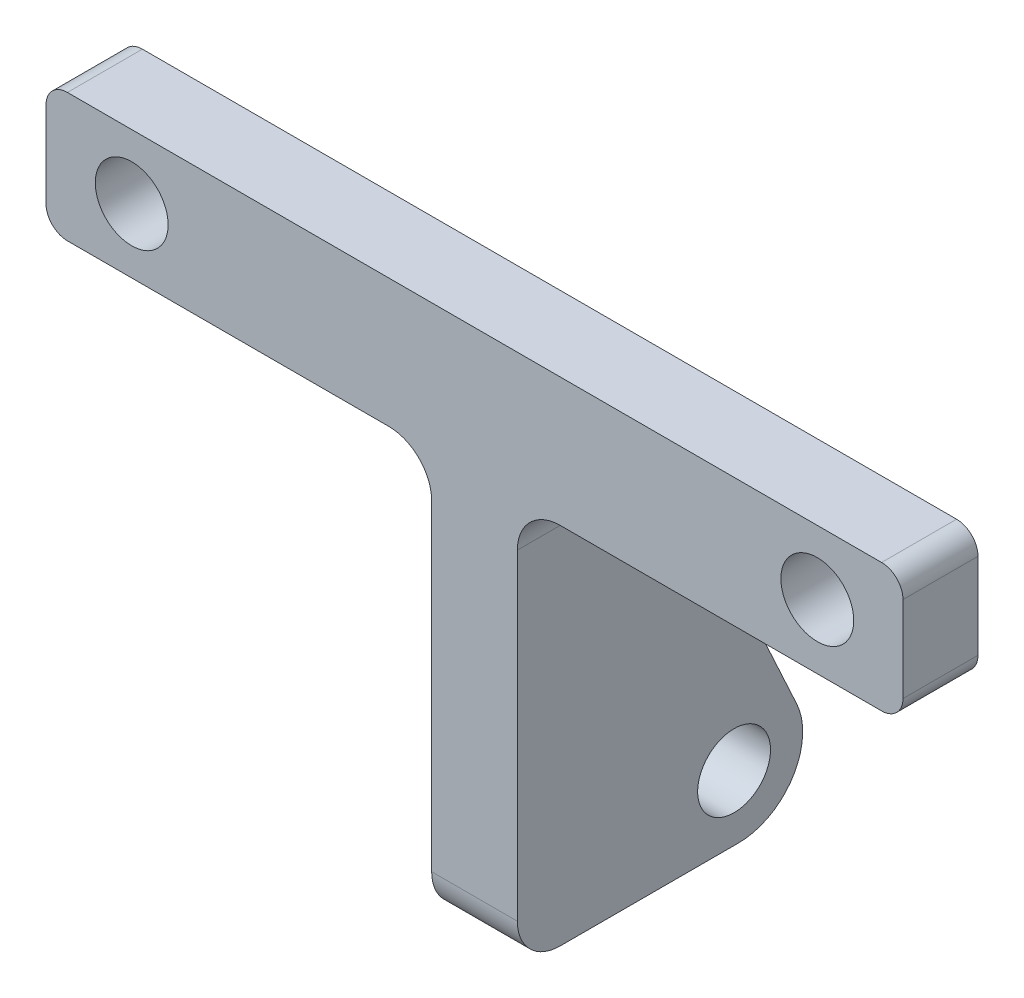
ISO-10303-21;
HEADER;
FILE_DESCRIPTION(('STEP AP214'),'2;1');
FILE_NAME('part.step','',(''),(''),'','','');
FILE_SCHEMA(('AUTOMOTIVE_DESIGN { 1 0 10303 214 1 1 1 1 }'));
ENDSEC;
DATA;
#1=APPLICATION_CONTEXT('core data for automotive mechanical design processes');
#2=APPLICATION_PROTOCOL_DEFINITION('international standard','automotive_design',2000,#1);
#3=PRODUCT_CONTEXT('',#1,'mechanical');
#4=PRODUCT('Part','Part','',(#3));
#5=PRODUCT_RELATED_PRODUCT_CATEGORY('part','',(#4));
#6=PRODUCT_DEFINITION_FORMATION('','',#4);
#7=PRODUCT_DEFINITION_CONTEXT('part definition',#1,'design');
#8=PRODUCT_DEFINITION('design','',#6,#7);
#9=PRODUCT_DEFINITION_SHAPE('','',#8);
#10=(LENGTH_UNIT() NAMED_UNIT(*) SI_UNIT(.MILLI.,.METRE.));
#11=(NAMED_UNIT(*) PLANE_ANGLE_UNIT() SI_UNIT($,.RADIAN.));
#12=(NAMED_UNIT(*) SI_UNIT($,.STERADIAN.) SOLID_ANGLE_UNIT());
#13=UNCERTAINTY_MEASURE_WITH_UNIT(LENGTH_MEASURE(1.E-05),#10,'distance_accuracy_value','');
#14=(GEOMETRIC_REPRESENTATION_CONTEXT(3) GLOBAL_UNCERTAINTY_ASSIGNED_CONTEXT((#13)) GLOBAL_UNIT_ASSIGNED_CONTEXT((#10,
#11,#12)) REPRESENTATION_CONTEXT('',''));
#15=CARTESIAN_POINT('',(0.,0.,0.));
#16=DIRECTION('',(0.,0.,1.));
#17=DIRECTION('',(1.,0.,0.));
#18=AXIS2_PLACEMENT_3D('',#15,#16,#17);
#19=CARTESIAN_POINT('',(-19.,-2.,0.));
#20=DIRECTION('',(0.,0.,-1.));
#21=DIRECTION('',(-1.,0.,0.));
#22=AXIS2_PLACEMENT_3D('',#19,#20,#21);
#23=PLANE('',#22);
#24=CARTESIAN_POINT('',(-16.,0.,0.));
#25=DIRECTION('',(0.,0.,1.));
#26=DIRECTION('',(1.,0.,0.));
#27=AXIS2_PLACEMENT_3D('',#24,#25,#26);
#28=CIRCLE('',#27,1.7);
#29=CARTESIAN_POINT('',(-14.3,0.,0.));
#30=VERTEX_POINT('',#29);
#31=EDGE_CURVE('E266',#30,#30,#28,.T.);
#32=ORIENTED_EDGE('',*,*,#31,.T.);
#33=EDGE_LOOP('',(#32));
#34=FACE_BOUND('',#33,.T.);
#35=DIRECTION('',(-1.,0.,0.));
#36=VECTOR('',#35,1.);
#37=CARTESIAN_POINT('',(-19.,3.,0.));
#38=LINE('',#37,#36);
#39=CARTESIAN_POINT('',(-4.00000000000001,3.,0.));
#40=VERTEX_POINT('',#39);
#41=CARTESIAN_POINT('',(-19.,3.,0.));
#42=VERTEX_POINT('',#41);
#43=EDGE_CURVE('E295',#40,#42,#38,.T.);
#44=ORIENTED_EDGE('',*,*,#43,.F.);
#45=DIRECTION('',(0.,-1.,0.));
#46=VECTOR('',#45,1.);
#47=CARTESIAN_POINT('',(-4.00000000000001,-2.,0.));
#48=LINE('',#47,#46);
#49=CARTESIAN_POINT('',(-4.00000000000001,-3.,0.));
#50=VERTEX_POINT('',#49);
#51=EDGE_CURVE('E214',#40,#50,#48,.T.);
#52=ORIENTED_EDGE('',*,*,#51,.T.);
#53=DIRECTION('',(1.,0.,0.));
#54=VECTOR('',#53,1.);
#55=CARTESIAN_POINT('',(-19.,-3.,0.));
#56=LINE('',#55,#54);
#57=CARTESIAN_POINT('',(-19.,-3.,0.));
#58=VERTEX_POINT('',#57);
#59=EDGE_CURVE('E287',#58,#50,#56,.T.);
#60=ORIENTED_EDGE('',*,*,#59,.F.);
#61=CARTESIAN_POINT('',(-19.,-2.,0.));
#62=DIRECTION('',(0.,0.,1.));
#63=DIRECTION('',(-1.,0.,0.));
#64=AXIS2_PLACEMENT_3D('',#61,#62,#63);
#65=CIRCLE('',#64,1.);
#66=CARTESIAN_POINT('',(-20.,-2.,0.));
#67=VERTEX_POINT('',#66);
#68=EDGE_CURVE('E185',#67,#58,#65,.T.);
#69=ORIENTED_EDGE('',*,*,#68,.F.);
#70=DIRECTION('',(0.,-1.,0.));
#71=VECTOR('',#70,1.);
#72=CARTESIAN_POINT('',(-20.,-2.,0.));
#73=LINE('',#72,#71);
#74=CARTESIAN_POINT('',(-20.,2.,0.));
#75=VERTEX_POINT('',#74);
#76=EDGE_CURVE('E181',#75,#67,#73,.T.);
#77=ORIENTED_EDGE('',*,*,#76,.F.);
#78=CARTESIAN_POINT('',(-19.,2.,0.));
#79=DIRECTION('',(0.,0.,1.));
#80=DIRECTION('',(-1.,0.,0.));
#81=AXIS2_PLACEMENT_3D('',#78,#79,#80);
#82=CIRCLE('',#81,1.);
#83=EDGE_CURVE('E299',#42,#75,#82,.T.);
#84=ORIENTED_EDGE('',*,*,#83,.F.);
#85=EDGE_LOOP('',(#44,#52,#60,#69,#77,#84));
#86=FACE_BOUND('',#85,.T.);
#87=ADVANCED_FACE('F32',(#34,#86),#23,.T.);
#88=CARTESIAN_POINT('',(-19.,-3.,3.5));
#89=DIRECTION('',(0.,1.,0.));
#90=DIRECTION('',(0.,0.,1.));
#91=AXIS2_PLACEMENT_3D('',#88,#89,#90);
#92=PLANE('',#91);
#93=ORIENTED_EDGE('',*,*,#59,.T.);
#94=DIRECTION('',(0.,0.,-1.));
#95=VECTOR('',#94,1.);
#96=CARTESIAN_POINT('',(-3.99999999999999,-3.,3.50000000000001));
#97=LINE('',#96,#95);
#98=CARTESIAN_POINT('',(-3.99999999999999,-3.,3.5));
#99=VERTEX_POINT('',#98);
#100=EDGE_CURVE('E165',#50,#99,#97,.F.);
#101=ORIENTED_EDGE('',*,*,#100,.T.);
#102=DIRECTION('',(1.,0.,0.));
#103=VECTOR('',#102,1.);
#104=CARTESIAN_POINT('',(-19.,-3.,3.5));
#105=LINE('',#104,#103);
#106=CARTESIAN_POINT('',(-19.,-3.,3.5));
#107=VERTEX_POINT('',#106);
#108=EDGE_CURVE('E157',#107,#99,#105,.T.);
#109=ORIENTED_EDGE('',*,*,#108,.F.);
#110=DIRECTION('',(0.,0.,-1.));
#111=VECTOR('',#110,1.);
#112=CARTESIAN_POINT('',(-19.,-3.,3.5));
#113=LINE('',#112,#111);
#114=EDGE_CURVE('E162',#107,#58,#113,.T.);
#115=ORIENTED_EDGE('',*,*,#114,.T.);
#116=EDGE_LOOP('',(#93,#101,#109,#115));
#117=FACE_BOUND('',#116,.T.);
#118=ADVANCED_FACE('F160',(#117),#92,.F.);
#119=CARTESIAN_POINT('',(-19.,-2.,3.5));
#120=DIRECTION('',(0.,0.,-1.));
#121=DIRECTION('',(-1.,0.,0.));
#122=AXIS2_PLACEMENT_3D('',#119,#120,#121);
#123=PLANE('',#122);
#124=DIRECTION('',(0.,-1.,0.));
#125=VECTOR('',#124,1.);
#126=CARTESIAN_POINT('',(-1.99999999999999,-22.,3.50000000000001));
#127=LINE('',#126,#125);
#128=CARTESIAN_POINT('',(-1.99999999999999,-5.,3.50000000000001));
#129=VERTEX_POINT('',#128);
#130=CARTESIAN_POINT('',(-1.99999999999999,-20.,3.50000000000001));
#131=VERTEX_POINT('',#130);
#132=EDGE_CURVE('E234',#129,#131,#127,.T.);
#133=ORIENTED_EDGE('',*,*,#132,.T.);
#134=DIRECTION('',(-1.,0.,0.));
#135=VECTOR('',#134,1.);
#136=CARTESIAN_POINT('',(-19.,-20.,3.5));
#137=LINE('',#136,#135);
#138=CARTESIAN_POINT('',(2.00000000000001,-20.,3.49999999999999));
#139=VERTEX_POINT('',#138);
#140=EDGE_CURVE('E219',#131,#139,#137,.F.);
#141=ORIENTED_EDGE('',*,*,#140,.T.);
#142=DIRECTION('',(0.,-1.,0.));
#143=VECTOR('',#142,1.);
#144=CARTESIAN_POINT('',(2.00000000000001,-22.,3.49999999999999));
#145=LINE('',#144,#143);
#146=CARTESIAN_POINT('',(2.00000000000001,-5.,3.49999999999999));
#147=VERTEX_POINT('',#146);
#148=EDGE_CURVE('E251',#147,#139,#145,.T.);
#149=ORIENTED_EDGE('',*,*,#148,.F.);
#150=CARTESIAN_POINT('',(4.00000000000001,-5.,3.5));
#151=DIRECTION('',(0.,0.,-1.));
#152=DIRECTION('',(-1.,0.,0.));
#153=AXIS2_PLACEMENT_3D('',#150,#151,#152);
#154=CIRCLE('',#153,2.);
#155=CARTESIAN_POINT('',(4.00000000000001,-3.,3.5));
#156=VERTEX_POINT('',#155);
#157=EDGE_CURVE('E221',#147,#156,#154,.T.);
#158=ORIENTED_EDGE('',*,*,#157,.T.);
#159=CARTESIAN_POINT('',(19.,-3.,3.5));
#160=VERTEX_POINT('',#159);
#161=EDGE_CURVE('E169',#156,#160,#105,.T.);
#162=ORIENTED_EDGE('',*,*,#161,.T.);
#163=CARTESIAN_POINT('',(19.,-2.,3.5));
#164=DIRECTION('',(0.,0.,1.));
#165=DIRECTION('',(1.,0.,0.));
#166=AXIS2_PLACEMENT_3D('',#163,#164,#165);
#167=CIRCLE('',#166,1.);
#168=CARTESIAN_POINT('',(20.,-2.,3.5));
#169=VERTEX_POINT('',#168);
#170=EDGE_CURVE('E168',#160,#169,#167,.T.);
#171=ORIENTED_EDGE('',*,*,#170,.T.);
#172=DIRECTION('',(0.,1.,0.));
#173=VECTOR('',#172,1.);
#174=CARTESIAN_POINT('',(20.,-2.,3.5));
#175=LINE('',#174,#173);
#176=CARTESIAN_POINT('',(20.,2.,3.5));
#177=VERTEX_POINT('',#176);
#178=EDGE_CURVE('E275',#169,#177,#175,.T.);
#179=ORIENTED_EDGE('',*,*,#178,.T.);
#180=CARTESIAN_POINT('',(19.,2.,3.5));
#181=DIRECTION('',(0.,0.,1.));
#182=DIRECTION('',(-1.,0.,0.));
#183=AXIS2_PLACEMENT_3D('',#180,#181,#182);
#184=CIRCLE('',#183,1.);
#185=CARTESIAN_POINT('',(19.,3.,3.5));
#186=VERTEX_POINT('',#185);
#187=EDGE_CURVE('E277',#177,#186,#184,.T.);
#188=ORIENTED_EDGE('',*,*,#187,.T.);
#189=DIRECTION('',(-1.,0.,0.));
#190=VECTOR('',#189,1.);
#191=CARTESIAN_POINT('',(-19.,3.,3.5));
#192=LINE('',#191,#190);
#193=CARTESIAN_POINT('',(-19.,3.,3.5));
#194=VERTEX_POINT('',#193);
#195=EDGE_CURVE('E279',#186,#194,#192,.T.);
#196=ORIENTED_EDGE('',*,*,#195,.T.);
#197=CARTESIAN_POINT('',(-19.,2.,3.5));
#198=DIRECTION('',(0.,0.,1.));
#199=DIRECTION('',(-1.,0.,0.));
#200=AXIS2_PLACEMENT_3D('',#197,#198,#199);
#201=CIRCLE('',#200,1.);
#202=CARTESIAN_POINT('',(-20.,2.,3.5));
#203=VERTEX_POINT('',#202);
#204=EDGE_CURVE('E281',#194,#203,#201,.T.);
#205=ORIENTED_EDGE('',*,*,#204,.T.);
#206=DIRECTION('',(0.,-1.,0.));
#207=VECTOR('',#206,1.);
#208=CARTESIAN_POINT('',(-20.,-2.,3.5));
#209=LINE('',#208,#207);
#210=CARTESIAN_POINT('',(-20.,-2.,3.5));
#211=VERTEX_POINT('',#210);
#212=EDGE_CURVE('E177',#203,#211,#209,.T.);
#213=ORIENTED_EDGE('',*,*,#212,.T.);
#214=CARTESIAN_POINT('',(-19.,-2.,3.5));
#215=DIRECTION('',(0.,0.,1.));
#216=DIRECTION('',(-1.,0.,0.));
#217=AXIS2_PLACEMENT_3D('',#214,#215,#216);
#218=CIRCLE('',#217,1.);
#219=EDGE_CURVE('E172',#211,#107,#218,.T.);
#220=ORIENTED_EDGE('',*,*,#219,.T.);
#221=ORIENTED_EDGE('',*,*,#108,.T.);
#222=CARTESIAN_POINT('',(-3.99999999999999,-5.,3.5));
#223=DIRECTION('',(0.,0.,-1.));
#224=DIRECTION('',(-1.,0.,0.));
#225=AXIS2_PLACEMENT_3D('',#222,#223,#224);
#226=CIRCLE('',#225,2.);
#227=EDGE_CURVE('E226',#99,#129,#226,.T.);
#228=ORIENTED_EDGE('',*,*,#227,.T.);
#229=EDGE_LOOP('',(#133,#141,#149,#158,#162,#171,#179,#188,#196,#205,#213,#220,#221,#228));
#230=FACE_BOUND('',#229,.T.);
#231=CARTESIAN_POINT('',(16.,0.,3.5));
#232=DIRECTION('',(0.,0.,1.));
#233=DIRECTION('',(-1.,0.,0.));
#234=AXIS2_PLACEMENT_3D('',#231,#232,#233);
#235=CIRCLE('',#234,1.7);
#236=CARTESIAN_POINT('',(14.3,0.,3.5));
#237=VERTEX_POINT('',#236);
#238=EDGE_CURVE('E263',#237,#237,#235,.T.);
#239=ORIENTED_EDGE('',*,*,#238,.F.);
#240=EDGE_LOOP('',(#239));
#241=FACE_BOUND('',#240,.T.);
#242=CARTESIAN_POINT('',(-16.,0.,3.5));
#243=DIRECTION('',(0.,0.,1.));
#244=DIRECTION('',(1.,0.,0.));
#245=AXIS2_PLACEMENT_3D('',#242,#243,#244);
#246=CIRCLE('',#245,1.7);
#247=CARTESIAN_POINT('',(-14.3,0.,3.5));
#248=VERTEX_POINT('',#247);
#249=EDGE_CURVE('E269',#248,#248,#246,.T.);
#250=ORIENTED_EDGE('',*,*,#249,.F.);
#251=EDGE_LOOP('',(#250));
#252=FACE_BOUND('',#251,.T.);
#253=ADVANCED_FACE('F174',(#230,#241,#252),#123,.F.);
#254=CARTESIAN_POINT('',(3.99999999999999,-3.,0.));
#255=VERTEX_POINT('',#254);
#256=CARTESIAN_POINT('',(19.,-3.,0.));
#257=VERTEX_POINT('',#256);
#258=EDGE_CURVE('E286',#255,#257,#56,.T.);
#259=ORIENTED_EDGE('',*,*,#258,.F.);
#260=DIRECTION('',(0.,-1.,0.));
#261=VECTOR('',#260,1.);
#262=CARTESIAN_POINT('',(3.99999999999999,3.,0.));
#263=LINE('',#262,#261);
#264=CARTESIAN_POINT('',(3.99999999999999,3.,0.));
#265=VERTEX_POINT('',#264);
#266=EDGE_CURVE('E202',#255,#265,#263,.F.);
#267=ORIENTED_EDGE('',*,*,#266,.T.);
#268=CARTESIAN_POINT('',(19.,3.,0.));
#269=VERTEX_POINT('',#268);
#270=EDGE_CURVE('E296',#269,#265,#38,.T.);
#271=ORIENTED_EDGE('',*,*,#270,.F.);
#272=CARTESIAN_POINT('',(19.,2.,0.));
#273=DIRECTION('',(0.,0.,1.));
#274=DIRECTION('',(-1.,0.,0.));
#275=AXIS2_PLACEMENT_3D('',#272,#273,#274);
#276=CIRCLE('',#275,1.);
#277=CARTESIAN_POINT('',(20.,2.,0.));
#278=VERTEX_POINT('',#277);
#279=EDGE_CURVE('E293',#278,#269,#276,.T.);
#280=ORIENTED_EDGE('',*,*,#279,.F.);
#281=DIRECTION('',(0.,1.,0.));
#282=VECTOR('',#281,1.);
#283=CARTESIAN_POINT('',(20.,-2.,0.));
#284=LINE('',#283,#282);
#285=CARTESIAN_POINT('',(20.,-2.,0.));
#286=VERTEX_POINT('',#285);
#287=EDGE_CURVE('E291',#286,#278,#284,.T.);
#288=ORIENTED_EDGE('',*,*,#287,.F.);
#289=CARTESIAN_POINT('',(19.,-2.,0.));
#290=DIRECTION('',(0.,0.,1.));
#291=DIRECTION('',(1.,0.,0.));
#292=AXIS2_PLACEMENT_3D('',#289,#290,#291);
#293=CIRCLE('',#292,1.);
#294=EDGE_CURVE('E289',#257,#286,#293,.T.);
#295=ORIENTED_EDGE('',*,*,#294,.F.);
#296=EDGE_LOOP('',(#259,#267,#271,#280,#288,#295));
#297=FACE_BOUND('',#296,.T.);
#298=CARTESIAN_POINT('',(16.,0.,0.));
#299=DIRECTION('',(0.,0.,1.));
#300=DIRECTION('',(-1.,0.,0.));
#301=AXIS2_PLACEMENT_3D('',#298,#299,#300);
#302=CIRCLE('',#301,1.7);
#303=CARTESIAN_POINT('',(14.3,0.,0.));
#304=VERTEX_POINT('',#303);
#305=EDGE_CURVE('E262',#304,#304,#302,.T.);
#306=ORIENTED_EDGE('',*,*,#305,.T.);
#307=EDGE_LOOP('',(#306));
#308=FACE_BOUND('',#307,.T.);
#309=ADVANCED_FACE('F327',(#297,#308),#23,.T.);
#310=CARTESIAN_POINT('',(-19.,-2.,3.5));
#311=DIRECTION('',(0.,0.,-1.));
#312=DIRECTION('',(-1.,0.,0.));
#313=AXIS2_PLACEMENT_3D('',#310,#311,#312);
#314=CYLINDRICAL_SURFACE('',#313,1.);
#315=ORIENTED_EDGE('',*,*,#68,.T.);
#316=ORIENTED_EDGE('',*,*,#114,.F.);
#317=ORIENTED_EDGE('',*,*,#219,.F.);
#318=DIRECTION('',(0.,0.,-1.));
#319=VECTOR('',#318,1.);
#320=CARTESIAN_POINT('',(-20.,-2.,3.5));
#321=LINE('',#320,#319);
#322=EDGE_CURVE('E284',#211,#67,#321,.T.);
#323=ORIENTED_EDGE('',*,*,#322,.T.);
#324=EDGE_LOOP('',(#315,#316,#317,#323));
#325=FACE_BOUND('',#324,.T.);
#326=ADVANCED_FACE('F183',(#325),#314,.T.);
#327=ORIENTED_EDGE('',*,*,#161,.F.);
#328=DIRECTION('',(0.,0.,-1.));
#329=VECTOR('',#328,1.);
#330=CARTESIAN_POINT('',(4.00000000000001,-3.,3.49999999999992));
#331=LINE('',#330,#329);
#332=EDGE_CURVE('E186',#156,#255,#331,.T.);
#333=ORIENTED_EDGE('',*,*,#332,.T.);
#334=ORIENTED_EDGE('',*,*,#258,.T.);
#335=DIRECTION('',(0.,0.,-1.));
#336=VECTOR('',#335,1.);
#337=CARTESIAN_POINT('',(19.,-3.,3.5));
#338=LINE('',#337,#336);
#339=EDGE_CURVE('E187',#160,#257,#338,.T.);
#340=ORIENTED_EDGE('',*,*,#339,.F.);
#341=EDGE_LOOP('',(#327,#333,#334,#340));
#342=FACE_BOUND('',#341,.T.);
#343=ADVANCED_FACE('F345',(#342),#92,.F.);
#344=CARTESIAN_POINT('',(19.,-2.,3.5));
#345=DIRECTION('',(0.,0.,-1.));
#346=DIRECTION('',(-1.,0.,0.));
#347=AXIS2_PLACEMENT_3D('',#344,#345,#346);
#348=CYLINDRICAL_SURFACE('',#347,1.);
#349=ORIENTED_EDGE('',*,*,#294,.T.);
#350=DIRECTION('',(0.,0.,-1.));
#351=VECTOR('',#350,1.);
#352=CARTESIAN_POINT('',(20.,-2.,3.5));
#353=LINE('',#352,#351);
#354=EDGE_CURVE('E193',#169,#286,#353,.T.);
#355=ORIENTED_EDGE('',*,*,#354,.F.);
#356=ORIENTED_EDGE('',*,*,#170,.F.);
#357=ORIENTED_EDGE('',*,*,#339,.T.);
#358=EDGE_LOOP('',(#349,#355,#356,#357));
#359=FACE_BOUND('',#358,.T.);
#360=ADVANCED_FACE('F343',(#359),#348,.T.);
#361=CARTESIAN_POINT('',(20.,-2.,3.5));
#362=DIRECTION('',(-1.,0.,0.));
#363=DIRECTION('',(0.,0.,1.));
#364=AXIS2_PLACEMENT_3D('',#361,#362,#363);
#365=PLANE('',#364);
#366=ORIENTED_EDGE('',*,*,#287,.T.);
#367=DIRECTION('',(0.,0.,-1.));
#368=VECTOR('',#367,1.);
#369=CARTESIAN_POINT('',(20.,2.,3.5));
#370=LINE('',#369,#368);
#371=EDGE_CURVE('E312',#177,#278,#370,.T.);
#372=ORIENTED_EDGE('',*,*,#371,.F.);
#373=ORIENTED_EDGE('',*,*,#178,.F.);
#374=ORIENTED_EDGE('',*,*,#354,.T.);
#375=EDGE_LOOP('',(#366,#372,#373,#374));
#376=FACE_BOUND('',#375,.T.);
#377=ADVANCED_FACE('F319',(#376),#365,.F.);
#378=CARTESIAN_POINT('',(19.,2.,3.5));
#379=DIRECTION('',(0.,0.,-1.));
#380=DIRECTION('',(-1.,0.,0.));
#381=AXIS2_PLACEMENT_3D('',#378,#379,#380);
#382=CYLINDRICAL_SURFACE('',#381,1.);
#383=ORIENTED_EDGE('',*,*,#279,.T.);
#384=DIRECTION('',(0.,0.,-1.));
#385=VECTOR('',#384,1.);
#386=CARTESIAN_POINT('',(19.,3.,3.5));
#387=LINE('',#386,#385);
#388=EDGE_CURVE('E309',#186,#269,#387,.T.);
#389=ORIENTED_EDGE('',*,*,#388,.F.);
#390=ORIENTED_EDGE('',*,*,#187,.F.);
#391=ORIENTED_EDGE('',*,*,#371,.T.);
#392=EDGE_LOOP('',(#383,#389,#390,#391));
#393=FACE_BOUND('',#392,.T.);
#394=ADVANCED_FACE('F332',(#393),#382,.T.);
#395=CARTESIAN_POINT('',(-19.,3.,3.5));
#396=DIRECTION('',(0.,-1.,0.));
#397=DIRECTION('',(0.,0.,-1.));
#398=AXIS2_PLACEMENT_3D('',#395,#396,#397);
#399=PLANE('',#398);
#400=ORIENTED_EDGE('',*,*,#270,.T.);
#401=DIRECTION('',(-1.,0.,0.));
#402=VECTOR('',#401,1.);
#403=CARTESIAN_POINT('',(2.,3.,0.));
#404=LINE('',#403,#402);
#405=EDGE_CURVE('E260',#265,#40,#404,.T.);
#406=ORIENTED_EDGE('',*,*,#405,.T.);
#407=ORIENTED_EDGE('',*,*,#43,.T.);
#408=DIRECTION('',(0.,0.,-1.));
#409=VECTOR('',#408,1.);
#410=CARTESIAN_POINT('',(-19.,3.,3.5));
#411=LINE('',#410,#409);
#412=EDGE_CURVE('E306',#194,#42,#411,.T.);
#413=ORIENTED_EDGE('',*,*,#412,.F.);
#414=ORIENTED_EDGE('',*,*,#195,.F.);
#415=ORIENTED_EDGE('',*,*,#388,.T.);
#416=EDGE_LOOP('',(#400,#406,#407,#413,#414,#415));
#417=FACE_BOUND('',#416,.T.);
#418=ADVANCED_FACE('F336',(#417),#399,.F.);
#419=CARTESIAN_POINT('',(-19.,2.,3.5));
#420=DIRECTION('',(0.,0.,-1.));
#421=DIRECTION('',(-1.,0.,0.));
#422=AXIS2_PLACEMENT_3D('',#419,#420,#421);
#423=CYLINDRICAL_SURFACE('',#422,1.);
#424=ORIENTED_EDGE('',*,*,#83,.T.);
#425=DIRECTION('',(0.,0.,-1.));
#426=VECTOR('',#425,1.);
#427=CARTESIAN_POINT('',(-20.,2.,3.5));
#428=LINE('',#427,#426);
#429=EDGE_CURVE('E303',#203,#75,#428,.T.);
#430=ORIENTED_EDGE('',*,*,#429,.F.);
#431=ORIENTED_EDGE('',*,*,#204,.F.);
#432=ORIENTED_EDGE('',*,*,#412,.T.);
#433=EDGE_LOOP('',(#424,#430,#431,#432));
#434=FACE_BOUND('',#433,.T.);
#435=ADVANCED_FACE('F358',(#434),#423,.T.);
#436=CARTESIAN_POINT('',(-20.,-2.,3.5));
#437=DIRECTION('',(1.,0.,0.));
#438=DIRECTION('',(0.,0.,-1.));
#439=AXIS2_PLACEMENT_3D('',#436,#437,#438);
#440=PLANE('',#439);
#441=ORIENTED_EDGE('',*,*,#76,.T.);
#442=ORIENTED_EDGE('',*,*,#322,.F.);
#443=ORIENTED_EDGE('',*,*,#212,.F.);
#444=ORIENTED_EDGE('',*,*,#429,.T.);
#445=EDGE_LOOP('',(#441,#442,#443,#444));
#446=FACE_BOUND('',#445,.T.);
#447=ADVANCED_FACE('F360',(#446),#440,.F.);
#448=CARTESIAN_POINT('',(-16.,0.,3.5));
#449=DIRECTION('',(0.,0.,-1.));
#450=DIRECTION('',(-1.,0.,0.));
#451=AXIS2_PLACEMENT_3D('',#448,#449,#450);
#452=CYLINDRICAL_SURFACE('',#451,1.7);
#453=ORIENTED_EDGE('',*,*,#249,.T.);
#454=EDGE_LOOP('',(#453));
#455=FACE_BOUND('',#454,.T.);
#456=ORIENTED_EDGE('',*,*,#31,.F.);
#457=EDGE_LOOP('',(#456));
#458=FACE_BOUND('',#457,.T.);
#459=ADVANCED_FACE('F413',(#455,#458),#452,.F.);
#460=CARTESIAN_POINT('',(16.,0.,3.5));
#461=DIRECTION('',(0.,0.,-1.));
#462=DIRECTION('',(-1.,0.,0.));
#463=AXIS2_PLACEMENT_3D('',#460,#461,#462);
#464=CYLINDRICAL_SURFACE('',#463,1.7);
#465=ORIENTED_EDGE('',*,*,#238,.T.);
#466=EDGE_LOOP('',(#465));
#467=FACE_BOUND('',#466,.T.);
#468=ORIENTED_EDGE('',*,*,#305,.F.);
#469=EDGE_LOOP('',(#468));
#470=FACE_BOUND('',#469,.T.);
#471=ADVANCED_FACE('F416',(#467,#470),#464,.F.);
#472=CARTESIAN_POINT('',(1.99999999999996,-22.,-11.5));
#473=DIRECTION('',(0.,1.,0.));
#474=DIRECTION('',(0.,0.,1.));
#475=AXIS2_PLACEMENT_3D('',#472,#473,#474);
#476=PLANE('',#475);
#477=DIRECTION('',(0.,0.,-1.));
#478=VECTOR('',#477,1.);
#479=CARTESIAN_POINT('',(-2.00000000000004,-22.,-11.5));
#480=LINE('',#479,#478);
#481=CARTESIAN_POINT('',(-1.99999999999999,-22.,1.5));
#482=VERTEX_POINT('',#481);
#483=CARTESIAN_POINT('',(-2.00000000000002,-22.,-6.81781890260391));
#484=VERTEX_POINT('',#483);
#485=EDGE_CURVE('E252',#482,#484,#480,.T.);
#486=ORIENTED_EDGE('',*,*,#485,.T.);
#487=DIRECTION('',(-1.,0.,0.));
#488=VECTOR('',#487,1.);
#489=CARTESIAN_POINT('',(1.99999999999998,-22.,-6.81781890260392));
#490=LINE('',#489,#488);
#491=CARTESIAN_POINT('',(1.99999999999998,-22.,-6.81781890260392));
#492=VERTEX_POINT('',#491);
#493=EDGE_CURVE('E40',#484,#492,#490,.F.);
#494=ORIENTED_EDGE('',*,*,#493,.T.);
#495=DIRECTION('',(0.,0.,-1.));
#496=VECTOR('',#495,1.);
#497=CARTESIAN_POINT('',(1.99999999999996,-22.,-11.5));
#498=LINE('',#497,#496);
#499=CARTESIAN_POINT('',(2.00000000000001,-22.,1.5));
#500=VERTEX_POINT('',#499);
#501=EDGE_CURVE('E255',#500,#492,#498,.T.);
#502=ORIENTED_EDGE('',*,*,#501,.F.);
#503=DIRECTION('',(-1.,0.,0.));
#504=VECTOR('',#503,1.);
#505=CARTESIAN_POINT('',(1.99999999999996,-22.,1.5));
#506=LINE('',#505,#504);
#507=EDGE_CURVE('E216',#500,#482,#506,.T.);
#508=ORIENTED_EDGE('',*,*,#507,.T.);
#509=EDGE_LOOP('',(#486,#494,#502,#508));
#510=FACE_BOUND('',#509,.T.);
#511=ADVANCED_FACE('F420',(#510),#476,.F.);
#512=CARTESIAN_POINT('',(2.,3.,0.));
#513=DIRECTION('',(0.,-0.417905608232144,0.908490452678575));
#514=DIRECTION('',(0.,-0.908490452678575,-0.417905608232144));
#515=AXIS2_PLACEMENT_3D('',#512,#513,#514);
#516=PLANE('',#515);
#517=DIRECTION('',(0.,0.908490452678575,0.417905608232144));
#518=VECTOR('',#517,1.);
#519=CARTESIAN_POINT('',(2.,3.,0.));
#520=LINE('',#519,#518);
#521=CARTESIAN_POINT('',(1.99999999999997,-17.7462831753036,-9.54329026063965));
#522=VERTEX_POINT('',#521);
#523=CARTESIAN_POINT('',(1.99999999999999,-1.34782608695649,-1.99999999999999));
#524=VERTEX_POINT('',#523);
#525=EDGE_CURVE('E245',#522,#524,#520,.T.);
#526=ORIENTED_EDGE('',*,*,#525,.F.);
#527=DIRECTION('',(-1.,0.,0.));
#528=VECTOR('',#527,1.);
#529=CARTESIAN_POINT('',(1.99999999999997,-17.7462831753036,-9.54329026063965));
#530=LINE('',#529,#528);
#531=CARTESIAN_POINT('',(-2.00000000000003,-17.7462831753036,-9.54329026063963));
#532=VERTEX_POINT('',#531);
#533=EDGE_CURVE('E231',#522,#532,#530,.T.);
#534=ORIENTED_EDGE('',*,*,#533,.T.);
#535=DIRECTION('',(0.,0.908490452678575,0.417905608232144));
#536=VECTOR('',#535,1.);
#537=CARTESIAN_POINT('',(-2.,3.,0.));
#538=LINE('',#537,#536);
#539=CARTESIAN_POINT('',(-2.00000000000001,-1.34782608695655,-2.00000000000001));
#540=VERTEX_POINT('',#539);
#541=EDGE_CURVE('E244',#532,#540,#538,.T.);
#542=ORIENTED_EDGE('',*,*,#541,.T.);
#543=CARTESIAN_POINT('',(-4.00000000000001,-1.34782608695655,-2.));
#544=DIRECTION('',(0.,-0.417905608232144,0.908490452678575));
#545=DIRECTION('',(0.,-0.908490452678575,-0.417905608232144));
#546=AXIS2_PLACEMENT_3D('',#543,#544,#545);
#547=ELLIPSE('',#546,4.78576970637114,2.);
#548=EDGE_CURVE('E228',#540,#40,#547,.T.);
#549=ORIENTED_EDGE('',*,*,#548,.T.);
#550=ORIENTED_EDGE('',*,*,#405,.F.);
#551=CARTESIAN_POINT('',(3.99999999999999,-1.34782608695649,-2.));
#552=DIRECTION('',(0.,-0.417905608232144,0.908490452678575));
#553=DIRECTION('',(0.,0.908490452678575,0.417905608232144));
#554=AXIS2_PLACEMENT_3D('',#551,#552,#553);
#555=ELLIPSE('',#554,4.78576970637114,2.);
#556=EDGE_CURVE('E223',#265,#524,#555,.T.);
#557=ORIENTED_EDGE('',*,*,#556,.T.);
#558=EDGE_LOOP('',(#526,#534,#542,#549,#550,#557));
#559=FACE_BOUND('',#558,.T.);
#560=ADVANCED_FACE('F243',(#559),#516,.F.);
#561=CARTESIAN_POINT('',(2.,0.,0.));
#562=DIRECTION('',(1.,0.,0.));
#563=DIRECTION('',(0.,0.,-1.));
#564=AXIS2_PLACEMENT_3D('',#561,#562,#563);
#565=PLANE('',#564);
#566=CARTESIAN_POINT('',(1.99999999999998,-18.9730561202843,-6.61581520096633));
#567=DIRECTION('',(1.,0.,0.));
#568=DIRECTION('',(0.,0.,-1.));
#569=AXIS2_PLACEMENT_3D('',#566,#567,#568);
#570=CIRCLE('',#569,1.7);
#571=CARTESIAN_POINT('',(1.99999999999997,-18.9730561202843,-8.31581520096633));
#572=VERTEX_POINT('',#571);
#573=EDGE_CURVE('E372',#572,#572,#570,.T.);
#574=ORIENTED_EDGE('',*,*,#573,.F.);
#575=EDGE_LOOP('',(#574));
#576=FACE_BOUND('',#575,.T.);
#577=ORIENTED_EDGE('',*,*,#501,.T.);
#578=CARTESIAN_POINT('',(1.99999999999998,-19.,-6.81781890260392));
#579=DIRECTION('',(1.,0.,0.));
#580=DIRECTION('',(0.,0.,-1.));
#581=AXIS2_PLACEMENT_3D('',#578,#579,#580);
#582=CIRCLE('',#581,3.);
#583=EDGE_CURVE('E11',#492,#522,#582,.T.);
#584=ORIENTED_EDGE('',*,*,#583,.T.);
#585=ORIENTED_EDGE('',*,*,#525,.T.);
#586=DIRECTION('',(0.,-1.,0.));
#587=VECTOR('',#586,1.);
#588=CARTESIAN_POINT('',(1.99999999999999,-3.,-1.99999999999999));
#589=LINE('',#588,#587);
#590=CARTESIAN_POINT('',(1.99999999999999,-5.,-1.99999999999999));
#591=VERTEX_POINT('',#590);
#592=EDGE_CURVE('E198',#524,#591,#589,.T.);
#593=ORIENTED_EDGE('',*,*,#592,.T.);
#594=DIRECTION('',(0.,0.,-1.));
#595=VECTOR('',#594,1.);
#596=CARTESIAN_POINT('',(2.,-5.,0.));
#597=LINE('',#596,#595);
#598=EDGE_CURVE('E200',#591,#147,#597,.F.);
#599=ORIENTED_EDGE('',*,*,#598,.T.);
#600=ORIENTED_EDGE('',*,*,#148,.T.);
#601=CARTESIAN_POINT('',(2.00000000000001,-20.,1.5));
#602=DIRECTION('',(1.,0.,0.));
#603=DIRECTION('',(0.,0.,-1.));
#604=AXIS2_PLACEMENT_3D('',#601,#602,#603);
#605=CIRCLE('',#604,2.);
#606=EDGE_CURVE('E190',#139,#500,#605,.T.);
#607=ORIENTED_EDGE('',*,*,#606,.T.);
#608=EDGE_LOOP('',(#577,#584,#585,#593,#599,#600,#607));
#609=FACE_BOUND('',#608,.T.);
#610=ADVANCED_FACE('F386',(#576,#609),#565,.T.);
#611=CARTESIAN_POINT('',(-2.,0.,0.));
#612=DIRECTION('',(1.,0.,0.));
#613=DIRECTION('',(0.,0.,-1.));
#614=AXIS2_PLACEMENT_3D('',#611,#612,#613);
#615=PLANE('',#614);
#616=CARTESIAN_POINT('',(-2.00000000000002,-18.9730561202843,-6.61581520096632));
#617=DIRECTION('',(1.,0.,0.));
#618=DIRECTION('',(0.,0.,-1.));
#619=AXIS2_PLACEMENT_3D('',#616,#617,#618);
#620=CIRCLE('',#619,1.7);
#621=CARTESIAN_POINT('',(-2.00000000000003,-18.9730561202843,-8.31581520096632));
#622=VERTEX_POINT('',#621);
#623=EDGE_CURVE('E237',#622,#622,#620,.T.);
#624=ORIENTED_EDGE('',*,*,#623,.T.);
#625=EDGE_LOOP('',(#624));
#626=FACE_BOUND('',#625,.T.);
#627=ORIENTED_EDGE('',*,*,#541,.F.);
#628=CARTESIAN_POINT('',(-2.00000000000002,-19.,-6.81781890260391));
#629=DIRECTION('',(1.,0.,0.));
#630=DIRECTION('',(0.,0.,-1.));
#631=AXIS2_PLACEMENT_3D('',#628,#629,#630);
#632=CIRCLE('',#631,3.);
#633=EDGE_CURVE('E54',#532,#484,#632,.F.);
#634=ORIENTED_EDGE('',*,*,#633,.T.);
#635=ORIENTED_EDGE('',*,*,#485,.F.);
#636=CARTESIAN_POINT('',(-2.,-20.,1.5));
#637=DIRECTION('',(1.,0.,0.));
#638=DIRECTION('',(0.,0.,-1.));
#639=AXIS2_PLACEMENT_3D('',#636,#637,#638);
#640=CIRCLE('',#639,2.);
#641=EDGE_CURVE('E205',#482,#131,#640,.F.);
#642=ORIENTED_EDGE('',*,*,#641,.T.);
#643=ORIENTED_EDGE('',*,*,#132,.F.);
#644=DIRECTION('',(0.,0.,-1.));
#645=VECTOR('',#644,1.);
#646=CARTESIAN_POINT('',(-2.,-5.,0.));
#647=LINE('',#646,#645);
#648=CARTESIAN_POINT('',(-2.00000000000001,-5.,-2.00000000000001));
#649=VERTEX_POINT('',#648);
#650=EDGE_CURVE('E210',#129,#649,#647,.T.);
#651=ORIENTED_EDGE('',*,*,#650,.T.);
#652=DIRECTION('',(0.,-1.,0.));
#653=VECTOR('',#652,1.);
#654=CARTESIAN_POINT('',(-2.00000000000001,0.,-2.00000000000001));
#655=LINE('',#654,#653);
#656=EDGE_CURVE('E207',#649,#540,#655,.F.);
#657=ORIENTED_EDGE('',*,*,#656,.T.);
#658=EDGE_LOOP('',(#627,#634,#635,#642,#643,#651,#657));
#659=FACE_BOUND('',#658,.T.);
#660=ADVANCED_FACE('F248',(#626,#659),#615,.F.);
#661=CARTESIAN_POINT('',(3.99999999999999,0.,-2.));
#662=DIRECTION('',(0.,1.,0.));
#663=DIRECTION('',(-1.,0.,0.));
#664=AXIS2_PLACEMENT_3D('',#661,#662,#663);
#665=CYLINDRICAL_SURFACE('',#664,2.);
#666=ORIENTED_EDGE('',*,*,#556,.F.);
#667=ORIENTED_EDGE('',*,*,#266,.F.);
#668=CARTESIAN_POINT('',(3.99999999999999,-5.,-2.));
#669=DIRECTION('',(0.,0.707106781186547,-0.707106781186547));
#670=DIRECTION('',(0.,0.707106781186547,0.707106781186547));
#671=AXIS2_PLACEMENT_3D('',#668,#669,#670);
#672=ELLIPSE('',#671,2.82842712474619,2.);
#673=EDGE_CURVE('E232',#591,#255,#672,.T.);
#674=ORIENTED_EDGE('',*,*,#673,.F.);
#675=ORIENTED_EDGE('',*,*,#592,.F.);
#676=EDGE_LOOP('',(#666,#667,#674,#675));
#677=FACE_BOUND('',#676,.T.);
#678=ADVANCED_FACE('F350',(#677),#665,.F.);
#679=CARTESIAN_POINT('',(4.00000000000001,-5.,3.49999999999992));
#680=DIRECTION('',(0.,0.,-1.));
#681=DIRECTION('',(-1.,0.,0.));
#682=AXIS2_PLACEMENT_3D('',#679,#680,#681);
#683=CYLINDRICAL_SURFACE('',#682,2.);
#684=ORIENTED_EDGE('',*,*,#157,.F.);
#685=ORIENTED_EDGE('',*,*,#598,.F.);
#686=ORIENTED_EDGE('',*,*,#673,.T.);
#687=ORIENTED_EDGE('',*,*,#332,.F.);
#688=EDGE_LOOP('',(#684,#685,#686,#687));
#689=FACE_BOUND('',#688,.T.);
#690=ADVANCED_FACE('F430',(#689),#683,.F.);
#691=CARTESIAN_POINT('',(-4.00000000000001,-2.,-2.));
#692=DIRECTION('',(0.,-1.,0.));
#693=DIRECTION('',(1.,0.,0.));
#694=AXIS2_PLACEMENT_3D('',#691,#692,#693);
#695=CYLINDRICAL_SURFACE('',#694,2.);
#696=ORIENTED_EDGE('',*,*,#548,.F.);
#697=ORIENTED_EDGE('',*,*,#656,.F.);
#698=CARTESIAN_POINT('',(-4.00000000000001,-5.,-2.));
#699=DIRECTION('',(0.,-0.707106781186547,0.707106781186547));
#700=DIRECTION('',(0.,-0.707106781186547,-0.707106781186547));
#701=AXIS2_PLACEMENT_3D('',#698,#699,#700);
#702=ELLIPSE('',#701,2.82842712474619,2.);
#703=EDGE_CURVE('E235',#50,#649,#702,.F.);
#704=ORIENTED_EDGE('',*,*,#703,.F.);
#705=ORIENTED_EDGE('',*,*,#51,.F.);
#706=EDGE_LOOP('',(#696,#697,#704,#705));
#707=FACE_BOUND('',#706,.T.);
#708=ADVANCED_FACE('F366',(#707),#695,.F.);
#709=CARTESIAN_POINT('',(-4.,-5.,0.));
#710=DIRECTION('',(0.,0.,1.));
#711=DIRECTION('',(1.,0.,0.));
#712=AXIS2_PLACEMENT_3D('',#709,#710,#711);
#713=CYLINDRICAL_SURFACE('',#712,2.);
#714=ORIENTED_EDGE('',*,*,#227,.F.);
#715=ORIENTED_EDGE('',*,*,#100,.F.);
#716=ORIENTED_EDGE('',*,*,#703,.T.);
#717=ORIENTED_EDGE('',*,*,#650,.F.);
#718=EDGE_LOOP('',(#714,#715,#716,#717));
#719=FACE_BOUND('',#718,.T.);
#720=ADVANCED_FACE('F363',(#719),#713,.F.);
#721=CARTESIAN_POINT('',(1.99999999999996,-20.,1.5));
#722=DIRECTION('',(-1.,0.,0.));
#723=DIRECTION('',(0.,0.,1.));
#724=AXIS2_PLACEMENT_3D('',#721,#722,#723);
#725=CYLINDRICAL_SURFACE('',#724,2.);
#726=ORIENTED_EDGE('',*,*,#606,.F.);
#727=ORIENTED_EDGE('',*,*,#140,.F.);
#728=ORIENTED_EDGE('',*,*,#641,.F.);
#729=ORIENTED_EDGE('',*,*,#507,.F.);
#730=EDGE_LOOP('',(#726,#727,#728,#729));
#731=FACE_BOUND('',#730,.T.);
#732=ADVANCED_FACE('F382',(#731),#725,.T.);
#733=CARTESIAN_POINT('',(-2.00000000000002,-18.9730561202843,-6.61581520096632));
#734=DIRECTION('',(1.,0.,0.));
#735=DIRECTION('',(0.,0.,-1.));
#736=AXIS2_PLACEMENT_3D('',#733,#734,#735);
#737=CYLINDRICAL_SURFACE('',#736,1.7);
#738=ORIENTED_EDGE('',*,*,#623,.F.);
#739=EDGE_LOOP('',(#738));
#740=FACE_BOUND('',#739,.T.);
#741=ORIENTED_EDGE('',*,*,#573,.T.);
#742=EDGE_LOOP('',(#741));
#743=FACE_BOUND('',#742,.T.);
#744=ADVANCED_FACE('F379',(#740,#743),#737,.F.);
#745=CARTESIAN_POINT('',(1.99999999999998,-19.,-6.81781890260392));
#746=DIRECTION('',(-1.,0.,0.));
#747=DIRECTION('',(0.,0.,1.));
#748=AXIS2_PLACEMENT_3D('',#745,#746,#747);
#749=CYLINDRICAL_SURFACE('',#748,3.);
#750=ORIENTED_EDGE('',*,*,#583,.F.);
#751=ORIENTED_EDGE('',*,*,#493,.F.);
#752=ORIENTED_EDGE('',*,*,#633,.F.);
#753=ORIENTED_EDGE('',*,*,#533,.F.);
#754=EDGE_LOOP('',(#750,#751,#752,#753));
#755=FACE_BOUND('',#754,.T.);
#756=ADVANCED_FACE('F34',(#755),#749,.T.);
#757=CLOSED_SHELL('',(#87,#118,#253,#309,#326,#343,#360,#377,#394,#418,#435,#447,#459,#471,#511,
#560,#610,#660,#678,#690,#708,#720,#732,#744,#756));
#758=MANIFOLD_SOLID_BREP('B2',#757);
#759=ADVANCED_BREP_SHAPE_REPRESENTATION('',(#18,#758),#14);
#760=SHAPE_DEFINITION_REPRESENTATION(#9,#759);
ENDSEC;
END-ISO-10303-21;
